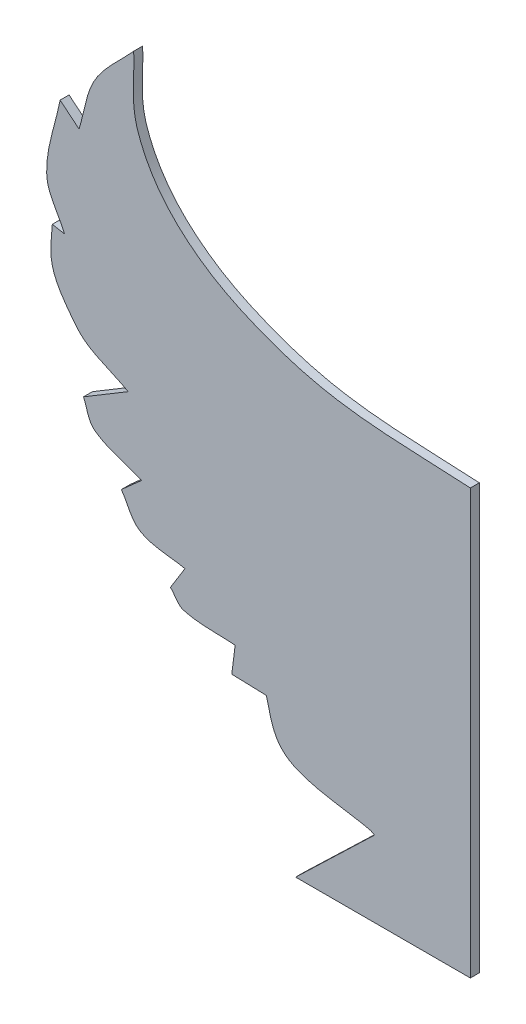
ISO-10303-21;
HEADER;
FILE_DESCRIPTION(('STEP AP214'),'2;1');
FILE_NAME('part.step','',(''),(''),'','','');
FILE_SCHEMA(('AUTOMOTIVE_DESIGN { 1 0 10303 214 1 1 1 1 }'));
ENDSEC;
DATA;
#1=APPLICATION_CONTEXT('core data for automotive mechanical design processes');
#2=APPLICATION_PROTOCOL_DEFINITION('international standard','automotive_design',2000,#1);
#3=PRODUCT_CONTEXT('',#1,'mechanical');
#4=PRODUCT('Part','Part','',(#3));
#5=PRODUCT_RELATED_PRODUCT_CATEGORY('part','',(#4));
#6=PRODUCT_DEFINITION_FORMATION('','',#4);
#7=PRODUCT_DEFINITION_CONTEXT('part definition',#1,'design');
#8=PRODUCT_DEFINITION('design','',#6,#7);
#9=PRODUCT_DEFINITION_SHAPE('','',#8);
#10=(LENGTH_UNIT() NAMED_UNIT(*) SI_UNIT(.MILLI.,.METRE.));
#11=(NAMED_UNIT(*) PLANE_ANGLE_UNIT() SI_UNIT($,.RADIAN.));
#12=(NAMED_UNIT(*) SI_UNIT($,.STERADIAN.) SOLID_ANGLE_UNIT());
#13=UNCERTAINTY_MEASURE_WITH_UNIT(LENGTH_MEASURE(1.E-05),#10,'distance_accuracy_value','');
#14=(GEOMETRIC_REPRESENTATION_CONTEXT(3) GLOBAL_UNCERTAINTY_ASSIGNED_CONTEXT((#13)) GLOBAL_UNIT_ASSIGNED_CONTEXT((#10,
#11,#12)) REPRESENTATION_CONTEXT('',''));
#15=CARTESIAN_POINT('',(0.,0.,0.));
#16=DIRECTION('',(0.,0.,1.));
#17=DIRECTION('',(1.,0.,0.));
#18=AXIS2_PLACEMENT_3D('',#15,#16,#17);
#19=CARTESIAN_POINT('',(-157.999999999995,101.119999999998,6.35));
#20=CARTESIAN_POINT('',(-154.480631293229,87.7463989142879,6.35));
#21=CARTESIAN_POINT('',(-153.288857754356,74.165061959317,6.35));
#22=CARTESIAN_POINT('',(-137.459999999995,67.1499999999983,6.35));
#23=CARTESIAN_POINT('',(-120.930466918882,59.8244114754145,6.35));
#24=CARTESIAN_POINT('',(-102.113096915258,59.5100372895688,6.35));
#25=CARTESIAN_POINT('',(-84.5299999999944,55.299999999999,6.35));
#26=CARTESIAN_POINT('',(-83.384709710233,55.0257755644223,6.35));
#27=CARTESIAN_POINT('',(-82.4233333333277,54.2466666666657,6.35));
#28=CARTESIAN_POINT('',(-81.3699999999944,53.719999999999,6.35));
#29=B_SPLINE_CURVE_WITH_KNOTS('',3,(#19,#20,#21,#22,#23,#24,#25,#26,#27,#28),.UNSPECIFIED.,.F.,
.F.,(4,3,3,4),(0.,1.,2.,3.),.UNSPECIFIED.);
#30=DIRECTION('',(0.,0.,-1.));
#31=VECTOR('',#30,1.);
#32=SURFACE_OF_LINEAR_EXTRUSION('',#29,#31);
#33=CARTESIAN_POINT('',(-157.999999999995,101.119999999998,0.));
#34=CARTESIAN_POINT('',(-154.480631293229,87.7463989142879,0.));
#35=CARTESIAN_POINT('',(-153.288857754356,74.165061959317,0.));
#36=CARTESIAN_POINT('',(-137.459999999995,67.1499999999983,0.));
#37=CARTESIAN_POINT('',(-120.930466918882,59.8244114754145,0.));
#38=CARTESIAN_POINT('',(-102.113096915258,59.5100372895688,0.));
#39=CARTESIAN_POINT('',(-84.5299999999944,55.299999999999,0.));
#40=CARTESIAN_POINT('',(-83.384709710233,55.0257755644223,0.));
#41=CARTESIAN_POINT('',(-82.4233333333277,54.2466666666657,0.));
#42=CARTESIAN_POINT('',(-81.3699999999944,53.719999999999,0.));
#43=B_SPLINE_CURVE_WITH_KNOTS('',3,(#33,#34,#35,#36,#37,#38,#39,#40,#41,#42),.UNSPECIFIED.,.F.,
.F.,(4,3,3,4),(0.,1.,2.,3.),.UNSPECIFIED.);
#44=CARTESIAN_POINT('',(-157.999999999995,101.119999999998,0.));
#45=VERTEX_POINT('',#44);
#46=CARTESIAN_POINT('',(-81.3699999999944,53.719999999999,0.));
#47=VERTEX_POINT('',#46);
#48=EDGE_CURVE('E193',#45,#47,#43,.T.);
#49=ORIENTED_EDGE('',*,*,#48,.T.);
#50=DIRECTION('',(0.,0.,-1.));
#51=VECTOR('',#50,1.);
#52=CARTESIAN_POINT('',(-81.3699999999944,53.719999999999,6.35));
#53=LINE('',#52,#51);
#54=CARTESIAN_POINT('',(-81.3699999999944,53.719999999999,6.35));
#55=VERTEX_POINT('',#54);
#56=EDGE_CURVE('E12',#55,#47,#53,.T.);
#57=ORIENTED_EDGE('',*,*,#56,.F.);
#58=CARTESIAN_POINT('',(-157.999999999995,101.119999999998,6.35));
#59=VERTEX_POINT('',#58);
#60=EDGE_CURVE('E267',#59,#55,#29,.T.);
#61=ORIENTED_EDGE('',*,*,#60,.F.);
#62=DIRECTION('',(0.,0.,-1.));
#63=VECTOR('',#62,1.);
#64=CARTESIAN_POINT('',(-157.999999999995,101.119999999998,6.35));
#65=LINE('',#64,#63);
#66=EDGE_CURVE('E186',#59,#45,#65,.T.);
#67=ORIENTED_EDGE('',*,*,#66,.T.);
#68=EDGE_LOOP('',(#49,#57,#61,#67));
#69=FACE_BOUND('',#68,.T.);
#70=ADVANCED_FACE('F33',(#69),#32,.F.);
#71=CARTESIAN_POINT('',(-81.3699999999944,53.719999999999,6.35));
#72=DIRECTION('',(0.693004296840328,-0.720933453628588,0.));
#73=DIRECTION('',(0.720933453628588,0.693004296840328,0.));
#74=AXIS2_PLACEMENT_3D('',#71,#72,#73);
#75=PLANE('',#74);
#76=DIRECTION('',(-0.720933453628588,-0.693004296840328,0.));
#77=VECTOR('',#76,1.);
#78=CARTESIAN_POINT('',(-81.3699999999944,53.719999999999,0.));
#79=LINE('',#78,#77);
#80=CARTESIAN_POINT('',(-137.255000000002,0.,0.));
#81=VERTEX_POINT('',#80);
#82=EDGE_CURVE('E198',#47,#81,#79,.T.);
#83=ORIENTED_EDGE('',*,*,#82,.T.);
#84=DIRECTION('',(0.,0.,-1.));
#85=VECTOR('',#84,1.);
#86=CARTESIAN_POINT('',(-137.255000000002,0.,6.35));
#87=LINE('',#86,#85);
#88=CARTESIAN_POINT('',(-137.255000000002,0.,6.35));
#89=VERTEX_POINT('',#88);
#90=EDGE_CURVE('E42',#89,#81,#87,.T.);
#91=ORIENTED_EDGE('',*,*,#90,.F.);
#92=DIRECTION('',(-0.720933453628588,-0.693004296840328,0.));
#93=VECTOR('',#92,1.);
#94=CARTESIAN_POINT('',(-81.3699999999944,53.719999999999,6.35));
#95=LINE('',#94,#93);
#96=EDGE_CURVE('E123',#55,#89,#95,.T.);
#97=ORIENTED_EDGE('',*,*,#96,.F.);
#98=ORIENTED_EDGE('',*,*,#56,.T.);
#99=EDGE_LOOP('',(#83,#91,#97,#98));
#100=FACE_BOUND('',#99,.T.);
#101=ADVANCED_FACE('F355',(#100),#75,.F.);
#102=CARTESIAN_POINT('',(-137.255000000002,0.,6.35));
#103=DIRECTION('',(0.,1.,0.));
#104=DIRECTION('',(0.,0.,1.));
#105=AXIS2_PLACEMENT_3D('',#102,#103,#104);
#106=PLANE('',#105);
#107=DIRECTION('',(1.,0.,0.));
#108=VECTOR('',#107,1.);
#109=CARTESIAN_POINT('',(-137.255000000002,0.,0.));
#110=LINE('',#109,#108);
#111=CARTESIAN_POINT('',(-13.4300000000021,0.,0.));
#112=VERTEX_POINT('',#111);
#113=EDGE_CURVE('E203',#81,#112,#110,.T.);
#114=ORIENTED_EDGE('',*,*,#113,.T.);
#115=DIRECTION('',(0.,0.,-1.));
#116=VECTOR('',#115,1.);
#117=CARTESIAN_POINT('',(-13.4300000000021,0.,6.35));
#118=LINE('',#117,#116);
#119=CARTESIAN_POINT('',(-13.4300000000021,0.,6.35));
#120=VERTEX_POINT('',#119);
#121=EDGE_CURVE('E304',#120,#112,#118,.T.);
#122=ORIENTED_EDGE('',*,*,#121,.F.);
#123=DIRECTION('',(1.,0.,0.));
#124=VECTOR('',#123,1.);
#125=CARTESIAN_POINT('',(-137.255000000002,0.,6.35));
#126=LINE('',#125,#124);
#127=EDGE_CURVE('E312',#89,#120,#126,.T.);
#128=ORIENTED_EDGE('',*,*,#127,.F.);
#129=ORIENTED_EDGE('',*,*,#90,.T.);
#130=EDGE_LOOP('',(#114,#122,#128,#129));
#131=FACE_BOUND('',#130,.T.);
#132=ADVANCED_FACE('F310',(#131),#106,.F.);
#133=CARTESIAN_POINT('',(-13.4300000000428,300.741120306681,6.35));
#134=DIRECTION('',(-1.,-1.35349919300316E-13,0.));
#135=DIRECTION('',(1.35349919300316E-13,-1.,0.));
#136=AXIS2_PLACEMENT_3D('',#133,#134,#135);
#137=PLANE('',#136);
#138=DIRECTION('',(-1.35349919300316E-13,1.,0.));
#139=VECTOR('',#138,1.);
#140=CARTESIAN_POINT('',(-13.4300000000428,300.741120306681,0.));
#141=LINE('',#140,#139);
#142=CARTESIAN_POINT('',(-13.4300000000428,300.741120306681,0.));
#143=VERTEX_POINT('',#142);
#144=EDGE_CURVE('E205',#112,#143,#141,.T.);
#145=ORIENTED_EDGE('',*,*,#144,.T.);
#146=DIRECTION('',(0.,0.,-1.));
#147=VECTOR('',#146,1.);
#148=CARTESIAN_POINT('',(-13.4300000000428,300.741120306681,6.35));
#149=LINE('',#148,#147);
#150=CARTESIAN_POINT('',(-13.4300000000428,300.741120306681,6.35));
#151=VERTEX_POINT('',#150);
#152=EDGE_CURVE('E301',#151,#143,#149,.T.);
#153=ORIENTED_EDGE('',*,*,#152,.F.);
#154=DIRECTION('',(-1.35349919300316E-13,1.,0.));
#155=VECTOR('',#154,1.);
#156=CARTESIAN_POINT('',(-13.4300000000428,300.741120306681,6.35));
#157=LINE('',#156,#155);
#158=EDGE_CURVE('E330',#120,#151,#157,.T.);
#159=ORIENTED_EDGE('',*,*,#158,.F.);
#160=ORIENTED_EDGE('',*,*,#121,.T.);
#161=EDGE_LOOP('',(#145,#153,#159,#160));
#162=FACE_BOUND('',#161,.T.);
#163=ADVANCED_FACE('F321',(#162),#137,.F.);
#164=CARTESIAN_POINT('',(-5.52999999999783,300.2,6.35));
#165=CARTESIAN_POINT('',(-40.5533333333312,302.833333333333,6.35));
#166=CARTESIAN_POINT('',(-75.9902994843211,302.121960820019,6.35));
#167=CARTESIAN_POINT('',(-110.599999999998,308.099999999999,6.35));
#168=CARTESIAN_POINT('',(-134.316102267515,312.196417664388,6.35));
#169=CARTESIAN_POINT('',(-157.597830165174,319.878484699289,6.35));
#170=CARTESIAN_POINT('',(-179.329999999998,330.219999999998,6.35));
#171=CARTESIAN_POINT('',(-196.219330524409,338.256991766786,6.35));
#172=CARTESIAN_POINT('',(-212.218015533089,349.096802748058,6.35));
#173=CARTESIAN_POINT('',(-225.149999999999,362.609999999997,6.35));
#174=CARTESIAN_POINT('',(-236.172283533926,374.127667063539,6.35));
#175=CARTESIAN_POINT('',(-244.932227199602,388.458970351653,6.35));
#176=CARTESIAN_POINT('',(-249.639999999999,403.689999999997,6.35));
#177=CARTESIAN_POINT('',(-254.156340492668,418.301689829219,6.35));
#178=CARTESIAN_POINT('',(-251.22,434.236666666663,6.35));
#179=CARTESIAN_POINT('',(-252.01,449.509999999997,6.35));
#180=B_SPLINE_CURVE_WITH_KNOTS('',3,(#164,#165,#166,#167,#168,#169,#170,#171,#172,#173,#174,
#175,#176,#177,#178,#179),.UNSPECIFIED.,.F.,.F.,(4,3,3,3,3,4),(0.,1.,2.,3.,4.,5.),.UNSPECIFIED.);
#181=DIRECTION('',(0.,0.,-1.));
#182=VECTOR('',#181,1.);
#183=SURFACE_OF_LINEAR_EXTRUSION('',#180,#182);
#184=CARTESIAN_POINT('',(-5.52999999999783,300.2,0.));
#185=CARTESIAN_POINT('',(-40.5533333333312,302.833333333333,0.));
#186=CARTESIAN_POINT('',(-75.9902994843211,302.121960820019,0.));
#187=CARTESIAN_POINT('',(-110.599999999998,308.099999999999,0.));
#188=CARTESIAN_POINT('',(-134.316102267515,312.196417664388,0.));
#189=CARTESIAN_POINT('',(-157.597830165174,319.878484699289,0.));
#190=CARTESIAN_POINT('',(-179.329999999998,330.219999999998,0.));
#191=CARTESIAN_POINT('',(-196.219330524409,338.256991766786,0.));
#192=CARTESIAN_POINT('',(-212.218015533089,349.096802748058,0.));
#193=CARTESIAN_POINT('',(-225.149999999999,362.609999999997,0.));
#194=CARTESIAN_POINT('',(-236.172283533926,374.127667063539,0.));
#195=CARTESIAN_POINT('',(-244.932227199602,388.458970351653,0.));
#196=CARTESIAN_POINT('',(-249.639999999999,403.689999999997,0.));
#197=CARTESIAN_POINT('',(-254.156340492668,418.301689829219,0.));
#198=CARTESIAN_POINT('',(-251.22,434.236666666663,0.));
#199=CARTESIAN_POINT('',(-252.01,449.509999999997,0.));
#200=B_SPLINE_CURVE_WITH_KNOTS('',3,(#184,#185,#186,#187,#188,#189,#190,#191,#192,#193,#194,
#195,#196,#197,#198,#199),.UNSPECIFIED.,.F.,.F.,(4,3,3,3,3,4),(0.,1.,2.,3.,4.,5.),.UNSPECIFIED.);
#201=CARTESIAN_POINT('',(-252.01,449.509999999997,0.));
#202=VERTEX_POINT('',#201);
#203=EDGE_CURVE('E207',#143,#202,#200,.T.);
#204=ORIENTED_EDGE('',*,*,#203,.T.);
#205=DIRECTION('',(0.,0.,-1.));
#206=VECTOR('',#205,1.);
#207=CARTESIAN_POINT('',(-252.01,449.509999999997,6.35));
#208=LINE('',#207,#206);
#209=CARTESIAN_POINT('',(-252.01,449.509999999997,6.35));
#210=VERTEX_POINT('',#209);
#211=EDGE_CURVE('E298',#210,#202,#208,.T.);
#212=ORIENTED_EDGE('',*,*,#211,.F.);
#213=EDGE_CURVE('E327',#151,#210,#180,.T.);
#214=ORIENTED_EDGE('',*,*,#213,.F.);
#215=ORIENTED_EDGE('',*,*,#152,.T.);
#216=EDGE_LOOP('',(#204,#212,#214,#215));
#217=FACE_BOUND('',#216,.T.);
#218=ADVANCED_FACE('F325',(#217),#183,.F.);
#219=CARTESIAN_POINT('',(-252.01,449.509999999997,6.35));
#220=CARTESIAN_POINT('',(-261.226666666667,438.976666666663,6.35));
#221=CARTESIAN_POINT('',(-272.669822336166,430.035818396443,6.35));
#222=CARTESIAN_POINT('',(-279.66,417.909999999996,6.35));
#223=CARTESIAN_POINT('',(-285.858024194383,407.158325377085,6.35));
#224=CARTESIAN_POINT('',(-287.033333333333,394.209999999996,6.35));
#225=CARTESIAN_POINT('',(-290.719999999999,382.359999999996,6.35));
#226=B_SPLINE_CURVE_WITH_KNOTS('',3,(#219,#220,#221,#222,#223,#224,#225),.UNSPECIFIED.,.F.,.F.,
(4,3,4),(0.,1.,2.),.UNSPECIFIED.);
#227=DIRECTION('',(0.,0.,-1.));
#228=VECTOR('',#227,1.);
#229=SURFACE_OF_LINEAR_EXTRUSION('',#226,#228);
#230=CARTESIAN_POINT('',(-252.01,449.509999999997,0.));
#231=CARTESIAN_POINT('',(-261.226666666667,438.976666666663,0.));
#232=CARTESIAN_POINT('',(-272.669822336166,430.035818396443,0.));
#233=CARTESIAN_POINT('',(-279.66,417.909999999996,0.));
#234=CARTESIAN_POINT('',(-285.858024194383,407.158325377085,0.));
#235=CARTESIAN_POINT('',(-287.033333333333,394.209999999996,0.));
#236=CARTESIAN_POINT('',(-290.719999999999,382.359999999996,0.));
#237=B_SPLINE_CURVE_WITH_KNOTS('',3,(#230,#231,#232,#233,#234,#235,#236),.UNSPECIFIED.,.F.,.F.,
(4,3,4),(0.,1.,2.),.UNSPECIFIED.);
#238=CARTESIAN_POINT('',(-290.719999999999,382.359999999996,0.));
#239=VERTEX_POINT('',#238);
#240=EDGE_CURVE('E211',#202,#239,#237,.T.);
#241=ORIENTED_EDGE('',*,*,#240,.T.);
#242=DIRECTION('',(0.,0.,-1.));
#243=VECTOR('',#242,1.);
#244=CARTESIAN_POINT('',(-290.719999999999,382.359999999996,6.35));
#245=LINE('',#244,#243);
#246=CARTESIAN_POINT('',(-290.719999999999,382.359999999996,6.35));
#247=VERTEX_POINT('',#246);
#248=EDGE_CURVE('E295',#247,#239,#245,.T.);
#249=ORIENTED_EDGE('',*,*,#248,.F.);
#250=EDGE_CURVE('E329',#210,#247,#226,.T.);
#251=ORIENTED_EDGE('',*,*,#250,.F.);
#252=ORIENTED_EDGE('',*,*,#211,.T.);
#253=EDGE_LOOP('',(#241,#249,#251,#252));
#254=FACE_BOUND('',#253,.T.);
#255=ADVANCED_FACE('F350',(#254),#229,.F.);
#256=CARTESIAN_POINT('',(-304.149999999999,393.419999999996,6.35));
#257=DIRECTION('',(-0.635707252861087,-0.771930235617061,0.));
#258=DIRECTION('',(0.771930235617061,-0.635707252861087,0.));
#259=AXIS2_PLACEMENT_3D('',#256,#257,#258);
#260=PLANE('',#259);
#261=DIRECTION('',(-0.771930235617061,0.635707252861086,0.));
#262=VECTOR('',#261,1.);
#263=CARTESIAN_POINT('',(-304.149999999999,393.419999999996,0.));
#264=LINE('',#263,#262);
#265=CARTESIAN_POINT('',(-304.149999999999,393.419999999996,0.));
#266=VERTEX_POINT('',#265);
#267=EDGE_CURVE('E218',#239,#266,#264,.T.);
#268=ORIENTED_EDGE('',*,*,#267,.T.);
#269=DIRECTION('',(0.,0.,-1.));
#270=VECTOR('',#269,1.);
#271=CARTESIAN_POINT('',(-304.149999999999,393.419999999996,6.35));
#272=LINE('',#271,#270);
#273=CARTESIAN_POINT('',(-304.149999999999,393.419999999996,6.35));
#274=VERTEX_POINT('',#273);
#275=EDGE_CURVE('E292',#274,#266,#272,.T.);
#276=ORIENTED_EDGE('',*,*,#275,.F.);
#277=DIRECTION('',(-0.771930235617061,0.635707252861086,0.));
#278=VECTOR('',#277,1.);
#279=CARTESIAN_POINT('',(-304.149999999999,393.419999999996,6.35));
#280=LINE('',#279,#278);
#281=EDGE_CURVE('E332',#247,#274,#280,.T.);
#282=ORIENTED_EDGE('',*,*,#281,.F.);
#283=ORIENTED_EDGE('',*,*,#248,.T.);
#284=EDGE_LOOP('',(#268,#276,#282,#283));
#285=FACE_BOUND('',#284,.T.);
#286=ADVANCED_FACE('F412',(#285),#260,.F.);
#287=CARTESIAN_POINT('',(-304.149999999999,393.419999999996,6.35));
#288=CARTESIAN_POINT('',(-307.309999999999,376.566666666663,6.35));
#289=CARTESIAN_POINT('',(-314.301915866732,359.993854601704,6.35));
#290=CARTESIAN_POINT('',(-313.629999999998,342.859999999996,6.35));
#291=CARTESIAN_POINT('',(-313.204542259722,332.010827622953,6.35));
#292=CARTESIAN_POINT('',(-305.203333333332,322.846666666663,6.35));
#293=CARTESIAN_POINT('',(-300.989999999998,312.839999999996,6.35));
#294=B_SPLINE_CURVE_WITH_KNOTS('',3,(#287,#288,#289,#290,#291,#292,#293),.UNSPECIFIED.,.F.,.F.,
(4,3,4),(0.,1.,2.),.UNSPECIFIED.);
#295=DIRECTION('',(0.,0.,-1.));
#296=VECTOR('',#295,1.);
#297=SURFACE_OF_LINEAR_EXTRUSION('',#294,#296);
#298=CARTESIAN_POINT('',(-304.149999999999,393.419999999996,0.));
#299=CARTESIAN_POINT('',(-307.309999999999,376.566666666663,0.));
#300=CARTESIAN_POINT('',(-314.301915866732,359.993854601704,0.));
#301=CARTESIAN_POINT('',(-313.629999999998,342.859999999996,0.));
#302=CARTESIAN_POINT('',(-313.204542259722,332.010827622953,0.));
#303=CARTESIAN_POINT('',(-305.203333333332,322.846666666663,0.));
#304=CARTESIAN_POINT('',(-300.989999999998,312.839999999996,0.));
#305=B_SPLINE_CURVE_WITH_KNOTS('',3,(#298,#299,#300,#301,#302,#303,#304),.UNSPECIFIED.,.F.,.F.,
(4,3,4),(0.,1.,2.),.UNSPECIFIED.);
#306=CARTESIAN_POINT('',(-300.989999999998,312.839999999996,0.));
#307=VERTEX_POINT('',#306);
#308=EDGE_CURVE('E223',#266,#307,#305,.T.);
#309=ORIENTED_EDGE('',*,*,#308,.T.);
#310=DIRECTION('',(0.,0.,-1.));
#311=VECTOR('',#310,1.);
#312=CARTESIAN_POINT('',(-300.989999999998,312.839999999996,6.35));
#313=LINE('',#312,#311);
#314=CARTESIAN_POINT('',(-300.989999999998,312.839999999996,6.35));
#315=VERTEX_POINT('',#314);
#316=EDGE_CURVE('E289',#315,#307,#313,.T.);
#317=ORIENTED_EDGE('',*,*,#316,.F.);
#318=EDGE_CURVE('E408',#274,#315,#294,.T.);
#319=ORIENTED_EDGE('',*,*,#318,.F.);
#320=ORIENTED_EDGE('',*,*,#275,.T.);
#321=EDGE_LOOP('',(#309,#317,#319,#320));
#322=FACE_BOUND('',#321,.T.);
#323=ADVANCED_FACE('F407',(#322),#297,.F.);
#324=CARTESIAN_POINT('',(-309.679999999998,314.419999999996,6.35));
#325=DIRECTION('',(-0.178885438199979,-0.983869910099908,0.));
#326=DIRECTION('',(0.983869910099908,-0.178885438199979,0.));
#327=AXIS2_PLACEMENT_3D('',#324,#325,#326);
#328=PLANE('',#327);
#329=DIRECTION('',(-0.983869910099908,0.178885438199979,0.));
#330=VECTOR('',#329,1.);
#331=CARTESIAN_POINT('',(-309.679999999998,314.419999999996,0.));
#332=LINE('',#331,#330);
#333=CARTESIAN_POINT('',(-309.679999999998,314.419999999996,0.));
#334=VERTEX_POINT('',#333);
#335=EDGE_CURVE('E227',#307,#334,#332,.T.);
#336=ORIENTED_EDGE('',*,*,#335,.T.);
#337=DIRECTION('',(0.,0.,-1.));
#338=VECTOR('',#337,1.);
#339=CARTESIAN_POINT('',(-309.679999999998,314.419999999996,6.35));
#340=LINE('',#339,#338);
#341=CARTESIAN_POINT('',(-309.679999999998,314.419999999996,6.35));
#342=VERTEX_POINT('',#341);
#343=EDGE_CURVE('E286',#342,#334,#340,.T.);
#344=ORIENTED_EDGE('',*,*,#343,.F.);
#345=DIRECTION('',(-0.983869910099908,0.178885438199979,0.));
#346=VECTOR('',#345,1.);
#347=CARTESIAN_POINT('',(-309.679999999998,314.419999999996,6.35));
#348=LINE('',#347,#346);
#349=EDGE_CURVE('E404',#315,#342,#348,.T.);
#350=ORIENTED_EDGE('',*,*,#349,.F.);
#351=ORIENTED_EDGE('',*,*,#316,.T.);
#352=EDGE_LOOP('',(#336,#344,#350,#351));
#353=FACE_BOUND('',#352,.T.);
#354=ADVANCED_FACE('F401',(#353),#328,.F.);
#355=CARTESIAN_POINT('',(-309.679999999998,314.419999999996,6.35));
#356=CARTESIAN_POINT('',(-311.452418298337,293.150980419928,6.35));
#357=CARTESIAN_POINT('',(-313.503064948443,285.722426893755,6.35));
#358=CARTESIAN_POINT('',(-292.299999999997,259.909999999996,6.35));
#359=CARTESIAN_POINT('',(-283.384566911672,249.056429283774,6.35));
#360=CARTESIAN_POINT('',(-268.07333333333,245.689999999996,6.35));
#361=CARTESIAN_POINT('',(-255.959999999997,238.579999999997,6.35));
#362=B_SPLINE_CURVE_WITH_KNOTS('',3,(#355,#356,#357,#358,#359,#360,#361),.UNSPECIFIED.,.F.,.F.,
(4,3,4),(0.,1.,2.),.UNSPECIFIED.);
#363=DIRECTION('',(0.,0.,-1.));
#364=VECTOR('',#363,1.);
#365=SURFACE_OF_LINEAR_EXTRUSION('',#362,#364);
#366=CARTESIAN_POINT('',(-309.679999999998,314.419999999996,0.));
#367=CARTESIAN_POINT('',(-311.452418298337,293.150980419928,0.));
#368=CARTESIAN_POINT('',(-313.503064948443,285.722426893755,0.));
#369=CARTESIAN_POINT('',(-292.299999999997,259.909999999996,0.));
#370=CARTESIAN_POINT('',(-283.384566911672,249.056429283774,0.));
#371=CARTESIAN_POINT('',(-268.07333333333,245.689999999996,0.));
#372=CARTESIAN_POINT('',(-255.959999999997,238.579999999997,0.));
#373=B_SPLINE_CURVE_WITH_KNOTS('',3,(#366,#367,#368,#369,#370,#371,#372),.UNSPECIFIED.,.F.,.F.,
(4,3,4),(0.,1.,2.),.UNSPECIFIED.);
#374=CARTESIAN_POINT('',(-255.959999999997,238.579999999997,0.));
#375=VERTEX_POINT('',#374);
#376=EDGE_CURVE('E232',#334,#375,#373,.T.);
#377=ORIENTED_EDGE('',*,*,#376,.T.);
#378=DIRECTION('',(0.,0.,-1.));
#379=VECTOR('',#378,1.);
#380=CARTESIAN_POINT('',(-255.959999999997,238.579999999997,6.35));
#381=LINE('',#380,#379);
#382=CARTESIAN_POINT('',(-255.959999999997,238.579999999997,6.35));
#383=VERTEX_POINT('',#382);
#384=EDGE_CURVE('E283',#383,#375,#381,.T.);
#385=ORIENTED_EDGE('',*,*,#384,.F.);
#386=EDGE_CURVE('E395',#342,#383,#362,.T.);
#387=ORIENTED_EDGE('',*,*,#386,.F.);
#388=ORIENTED_EDGE('',*,*,#343,.T.);
#389=EDGE_LOOP('',(#377,#385,#387,#388));
#390=FACE_BOUND('',#389,.T.);
#391=ADVANCED_FACE('F394',(#390),#365,.F.);
#392=CARTESIAN_POINT('',(-287.559999999997,219.619999999996,6.35));
#393=DIRECTION('',(0.514495755427536,-0.857492925712538,0.));
#394=DIRECTION('',(0.857492925712538,0.514495755427536,0.));
#395=AXIS2_PLACEMENT_3D('',#392,#393,#394);
#396=PLANE('',#395);
#397=DIRECTION('',(-0.857492925712538,-0.514495755427536,0.));
#398=VECTOR('',#397,1.);
#399=CARTESIAN_POINT('',(-287.559999999997,219.619999999996,0.));
#400=LINE('',#399,#398);
#401=CARTESIAN_POINT('',(-287.559999999997,219.619999999996,0.));
#402=VERTEX_POINT('',#401);
#403=EDGE_CURVE('E236',#375,#402,#400,.T.);
#404=ORIENTED_EDGE('',*,*,#403,.T.);
#405=DIRECTION('',(0.,0.,-1.));
#406=VECTOR('',#405,1.);
#407=CARTESIAN_POINT('',(-287.559999999997,219.619999999996,6.35));
#408=LINE('',#407,#406);
#409=CARTESIAN_POINT('',(-287.559999999997,219.619999999996,6.35));
#410=VERTEX_POINT('',#409);
#411=EDGE_CURVE('E280',#410,#402,#408,.T.);
#412=ORIENTED_EDGE('',*,*,#411,.F.);
#413=DIRECTION('',(-0.857492925712538,-0.514495755427536,0.));
#414=VECTOR('',#413,1.);
#415=CARTESIAN_POINT('',(-287.559999999997,219.619999999996,6.35));
#416=LINE('',#415,#414);
#417=EDGE_CURVE('E390',#383,#410,#416,.T.);
#418=ORIENTED_EDGE('',*,*,#417,.F.);
#419=ORIENTED_EDGE('',*,*,#384,.T.);
#420=EDGE_LOOP('',(#404,#412,#418,#419));
#421=FACE_BOUND('',#420,.T.);
#422=ADVANCED_FACE('F389',(#421),#396,.F.);
#423=CARTESIAN_POINT('',(-287.559999999997,219.619999999996,6.35));
#424=CARTESIAN_POINT('',(-284.926666666663,214.089999999996,6.35));
#425=CARTESIAN_POINT('',(-284.559981677967,206.704986258474,6.35));
#426=CARTESIAN_POINT('',(-279.659999999997,203.029999999996,6.35));
#427=CARTESIAN_POINT('',(-270.033662794185,195.810247095637,6.35));
#428=CARTESIAN_POINT('',(-257.539999999996,193.549999999997,6.35));
#429=CARTESIAN_POINT('',(-246.479999999996,188.809999999997,6.35));
#430=B_SPLINE_CURVE_WITH_KNOTS('',3,(#423,#424,#425,#426,#427,#428,#429),.UNSPECIFIED.,.F.,.F.,
(4,3,4),(0.,1.,2.),.UNSPECIFIED.);
#431=DIRECTION('',(0.,0.,-1.));
#432=VECTOR('',#431,1.);
#433=SURFACE_OF_LINEAR_EXTRUSION('',#430,#432);
#434=CARTESIAN_POINT('',(-287.559999999997,219.619999999996,0.));
#435=CARTESIAN_POINT('',(-284.926666666663,214.089999999996,0.));
#436=CARTESIAN_POINT('',(-284.559981677967,206.704986258474,0.));
#437=CARTESIAN_POINT('',(-279.659999999997,203.029999999996,0.));
#438=CARTESIAN_POINT('',(-270.033662794185,195.810247095637,0.));
#439=CARTESIAN_POINT('',(-257.539999999996,193.549999999997,0.));
#440=CARTESIAN_POINT('',(-246.479999999996,188.809999999997,0.));
#441=B_SPLINE_CURVE_WITH_KNOTS('',3,(#434,#435,#436,#437,#438,#439,#440),.UNSPECIFIED.,.F.,.F.,
(4,3,4),(0.,1.,2.),.UNSPECIFIED.);
#442=CARTESIAN_POINT('',(-246.479999999996,188.809999999997,0.));
#443=VERTEX_POINT('',#442);
#444=EDGE_CURVE('E241',#402,#443,#441,.T.);
#445=ORIENTED_EDGE('',*,*,#444,.T.);
#446=DIRECTION('',(0.,0.,-1.));
#447=VECTOR('',#446,1.);
#448=CARTESIAN_POINT('',(-246.479999999996,188.809999999997,6.35));
#449=LINE('',#448,#447);
#450=CARTESIAN_POINT('',(-246.479999999996,188.809999999997,6.35));
#451=VERTEX_POINT('',#450);
#452=EDGE_CURVE('E277',#451,#443,#449,.T.);
#453=ORIENTED_EDGE('',*,*,#452,.F.);
#454=EDGE_CURVE('E386',#410,#451,#430,.T.);
#455=ORIENTED_EDGE('',*,*,#454,.F.);
#456=ORIENTED_EDGE('',*,*,#411,.T.);
#457=EDGE_LOOP('',(#445,#453,#455,#456));
#458=FACE_BOUND('',#457,.T.);
#459=ADVANCED_FACE('F383',(#458),#433,.F.);
#460=CARTESIAN_POINT('',(-260.699999999996,176.169999999996,6.35));
#461=DIRECTION('',(0.664363838829933,-0.747409318683648,0.));
#462=DIRECTION('',(0.747409318683648,0.664363838829933,0.));
#463=AXIS2_PLACEMENT_3D('',#460,#461,#462);
#464=PLANE('',#463);
#465=DIRECTION('',(-0.747409318683648,-0.664363838829933,0.));
#466=VECTOR('',#465,1.);
#467=CARTESIAN_POINT('',(-260.699999999996,176.169999999996,0.));
#468=LINE('',#467,#466);
#469=CARTESIAN_POINT('',(-260.699999999996,176.169999999996,0.));
#470=VERTEX_POINT('',#469);
#471=EDGE_CURVE('E245',#443,#470,#468,.T.);
#472=ORIENTED_EDGE('',*,*,#471,.T.);
#473=DIRECTION('',(0.,0.,-1.));
#474=VECTOR('',#473,1.);
#475=CARTESIAN_POINT('',(-260.699999999996,176.169999999996,6.35));
#476=LINE('',#475,#474);
#477=CARTESIAN_POINT('',(-260.699999999996,176.169999999996,6.35));
#478=VERTEX_POINT('',#477);
#479=EDGE_CURVE('E274',#478,#470,#476,.T.);
#480=ORIENTED_EDGE('',*,*,#479,.F.);
#481=DIRECTION('',(-0.747409318683648,-0.664363838829933,0.));
#482=VECTOR('',#481,1.);
#483=CARTESIAN_POINT('',(-260.699999999996,176.169999999996,6.35));
#484=LINE('',#483,#482);
#485=EDGE_CURVE('E377',#451,#478,#484,.T.);
#486=ORIENTED_EDGE('',*,*,#485,.F.);
#487=ORIENTED_EDGE('',*,*,#452,.T.);
#488=EDGE_LOOP('',(#472,#480,#486,#487));
#489=FACE_BOUND('',#488,.T.);
#490=ADVANCED_FACE('F376',(#489),#464,.F.);
#491=CARTESIAN_POINT('',(-260.699999999996,176.169999999996,6.35));
#492=CARTESIAN_POINT('',(-256.223333333329,169.849999999997,6.35));
#493=CARTESIAN_POINT('',(-253.972610339402,161.090458617548,6.35));
#494=CARTESIAN_POINT('',(-247.269999999996,157.209999999997,6.35));
#495=CARTESIAN_POINT('',(-237.926280871085,151.800478399048,6.35));
#496=CARTESIAN_POINT('',(-226.203333333329,152.469999999997,6.35));
#497=CARTESIAN_POINT('',(-215.669999999996,150.099999999997,6.35));
#498=B_SPLINE_CURVE_WITH_KNOTS('',3,(#491,#492,#493,#494,#495,#496,#497),.UNSPECIFIED.,.F.,.F.,
(4,3,4),(0.,1.,2.),.UNSPECIFIED.);
#499=DIRECTION('',(0.,0.,-1.));
#500=VECTOR('',#499,1.);
#501=SURFACE_OF_LINEAR_EXTRUSION('',#498,#500);
#502=CARTESIAN_POINT('',(-260.699999999996,176.169999999996,0.));
#503=CARTESIAN_POINT('',(-256.223333333329,169.849999999997,0.));
#504=CARTESIAN_POINT('',(-253.972610339402,161.090458617548,0.));
#505=CARTESIAN_POINT('',(-247.269999999996,157.209999999997,0.));
#506=CARTESIAN_POINT('',(-237.926280871085,151.800478399048,0.));
#507=CARTESIAN_POINT('',(-226.203333333329,152.469999999997,0.));
#508=CARTESIAN_POINT('',(-215.669999999996,150.099999999997,0.));
#509=B_SPLINE_CURVE_WITH_KNOTS('',3,(#502,#503,#504,#505,#506,#507,#508),.UNSPECIFIED.,.F.,.F.,
(4,3,4),(0.,1.,2.),.UNSPECIFIED.);
#510=CARTESIAN_POINT('',(-215.669999999996,150.099999999997,0.));
#511=VERTEX_POINT('',#510);
#512=EDGE_CURVE('E250',#470,#511,#509,.T.);
#513=ORIENTED_EDGE('',*,*,#512,.T.);
#514=DIRECTION('',(0.,0.,-1.));
#515=VECTOR('',#514,1.);
#516=CARTESIAN_POINT('',(-215.669999999996,150.099999999997,6.35));
#517=LINE('',#516,#515);
#518=CARTESIAN_POINT('',(-215.669999999996,150.099999999997,6.35));
#519=VERTEX_POINT('',#518);
#520=EDGE_CURVE('E271',#519,#511,#517,.T.);
#521=ORIENTED_EDGE('',*,*,#520,.F.);
#522=EDGE_CURVE('E372',#478,#519,#498,.T.);
#523=ORIENTED_EDGE('',*,*,#522,.F.);
#524=ORIENTED_EDGE('',*,*,#479,.T.);
#525=EDGE_LOOP('',(#513,#521,#523,#524));
#526=FACE_BOUND('',#525,.T.);
#527=ADVANCED_FACE('F371',(#526),#501,.F.);
#528=CARTESIAN_POINT('',(-225.939999999996,133.509999999997,6.35));
#529=DIRECTION('',(0.850265146687871,-0.526354614616281,0.));
#530=DIRECTION('',(0.526354614616281,0.850265146687871,0.));
#531=AXIS2_PLACEMENT_3D('',#528,#529,#530);
#532=PLANE('',#531);
#533=DIRECTION('',(-0.526354614616281,-0.850265146687871,0.));
#534=VECTOR('',#533,1.);
#535=CARTESIAN_POINT('',(-225.939999999996,133.509999999997,0.));
#536=LINE('',#535,#534);
#537=CARTESIAN_POINT('',(-225.939999999996,133.509999999997,0.));
#538=VERTEX_POINT('',#537);
#539=EDGE_CURVE('E254',#511,#538,#536,.T.);
#540=ORIENTED_EDGE('',*,*,#539,.T.);
#541=DIRECTION('',(0.,0.,-1.));
#542=VECTOR('',#541,1.);
#543=CARTESIAN_POINT('',(-225.939999999996,133.509999999997,6.35));
#544=LINE('',#543,#542);
#545=CARTESIAN_POINT('',(-225.939999999996,133.509999999997,6.35));
#546=VERTEX_POINT('',#545);
#547=EDGE_CURVE('E181',#546,#538,#544,.T.);
#548=ORIENTED_EDGE('',*,*,#547,.F.);
#549=DIRECTION('',(-0.526354614616281,-0.850265146687871,0.));
#550=VECTOR('',#549,1.);
#551=CARTESIAN_POINT('',(-225.939999999996,133.509999999997,6.35));
#552=LINE('',#551,#550);
#553=EDGE_CURVE('E172',#519,#546,#552,.T.);
#554=ORIENTED_EDGE('',*,*,#553,.F.);
#555=ORIENTED_EDGE('',*,*,#520,.T.);
#556=EDGE_LOOP('',(#540,#548,#554,#555));
#557=FACE_BOUND('',#556,.T.);
#558=ADVANCED_FACE('F367',(#557),#532,.F.);
#559=CARTESIAN_POINT('',(-225.939999999996,133.509999999997,6.35));
#560=CARTESIAN_POINT('',(-222.779999999995,130.349999999997,6.35));
#561=CARTESIAN_POINT('',(-220.76800093363,125.218414050655,6.35));
#562=CARTESIAN_POINT('',(-216.459999999995,124.029999999997,6.35));
#563=CARTESIAN_POINT('',(-204.738771158725,120.796557561026,6.35));
#564=CARTESIAN_POINT('',(-192.233333333329,121.923333333331,6.35));
#565=CARTESIAN_POINT('',(-180.119999999995,120.869999999998,6.35));
#566=B_SPLINE_CURVE_WITH_KNOTS('',3,(#559,#560,#561,#562,#563,#564,#565),.UNSPECIFIED.,.F.,.F.,
(4,3,4),(0.,1.,2.),.UNSPECIFIED.);
#567=DIRECTION('',(0.,0.,-1.));
#568=VECTOR('',#567,1.);
#569=SURFACE_OF_LINEAR_EXTRUSION('',#566,#568);
#570=CARTESIAN_POINT('',(-225.939999999996,133.509999999997,0.));
#571=CARTESIAN_POINT('',(-222.779999999995,130.349999999997,0.));
#572=CARTESIAN_POINT('',(-220.76800093363,125.218414050655,0.));
#573=CARTESIAN_POINT('',(-216.459999999995,124.029999999997,0.));
#574=CARTESIAN_POINT('',(-204.738771158725,120.796557561026,0.));
#575=CARTESIAN_POINT('',(-192.233333333329,121.923333333331,0.));
#576=CARTESIAN_POINT('',(-180.119999999995,120.869999999998,0.));
#577=B_SPLINE_CURVE_WITH_KNOTS('',3,(#570,#571,#572,#573,#574,#575,#576),.UNSPECIFIED.,.F.,.F.,
(4,3,4),(0.,1.,2.),.UNSPECIFIED.);
#578=CARTESIAN_POINT('',(-180.119999999995,120.869999999998,0.));
#579=VERTEX_POINT('',#578);
#580=EDGE_CURVE('E180',#538,#579,#577,.T.);
#581=ORIENTED_EDGE('',*,*,#580,.T.);
#582=DIRECTION('',(0.,0.,-1.));
#583=VECTOR('',#582,1.);
#584=CARTESIAN_POINT('',(-180.119999999995,120.869999999998,6.35));
#585=LINE('',#584,#583);
#586=CARTESIAN_POINT('',(-180.119999999995,120.869999999998,6.35));
#587=VERTEX_POINT('',#586);
#588=EDGE_CURVE('E177',#587,#579,#585,.T.);
#589=ORIENTED_EDGE('',*,*,#588,.F.);
#590=EDGE_CURVE('E166',#546,#587,#566,.T.);
#591=ORIENTED_EDGE('',*,*,#590,.F.);
#592=ORIENTED_EDGE('',*,*,#547,.T.);
#593=EDGE_LOOP('',(#581,#589,#591,#592));
#594=FACE_BOUND('',#593,.T.);
#595=ADVANCED_FACE('F178',(#594),#569,.F.);
#596=CARTESIAN_POINT('',(-182.489999999995,101.909999999998,6.35));
#597=DIRECTION('',(0.99227787671367,-0.124034734589191,0.));
#598=DIRECTION('',(0.124034734589191,0.99227787671367,0.));
#599=AXIS2_PLACEMENT_3D('',#596,#597,#598);
#600=PLANE('',#599);
#601=DIRECTION('',(-0.124034734589191,-0.99227787671367,0.));
#602=VECTOR('',#601,1.);
#603=CARTESIAN_POINT('',(-182.489999999995,101.909999999998,0.));
#604=LINE('',#603,#602);
#605=CARTESIAN_POINT('',(-182.489999999995,101.909999999998,0.));
#606=VERTEX_POINT('',#605);
#607=EDGE_CURVE('E109',#579,#606,#604,.T.);
#608=ORIENTED_EDGE('',*,*,#607,.T.);
#609=DIRECTION('',(0.,0.,-1.));
#610=VECTOR('',#609,1.);
#611=CARTESIAN_POINT('',(-182.489999999995,101.909999999998,6.35));
#612=LINE('',#611,#610);
#613=CARTESIAN_POINT('',(-182.489999999995,101.909999999998,6.35));
#614=VERTEX_POINT('',#613);
#615=EDGE_CURVE('E182',#614,#606,#612,.T.);
#616=ORIENTED_EDGE('',*,*,#615,.F.);
#617=DIRECTION('',(-0.124034734589191,-0.99227787671367,0.));
#618=VECTOR('',#617,1.);
#619=CARTESIAN_POINT('',(-182.489999999995,101.909999999998,6.35));
#620=LINE('',#619,#618);
#621=EDGE_CURVE('E170',#587,#614,#620,.T.);
#622=ORIENTED_EDGE('',*,*,#621,.F.);
#623=ORIENTED_EDGE('',*,*,#588,.T.);
#624=EDGE_LOOP('',(#608,#616,#622,#623));
#625=FACE_BOUND('',#624,.T.);
#626=ADVANCED_FACE('F184',(#625),#600,.F.);
#627=CARTESIAN_POINT('',(-157.999999999995,101.119999999998,6.35));
#628=DIRECTION('',(0.0322412940109439,0.9994801143397,0.));
#629=DIRECTION('',(-0.9994801143397,0.0322412940109439,0.));
#630=AXIS2_PLACEMENT_3D('',#627,#628,#629);
#631=PLANE('',#630);
#632=DIRECTION('',(0.9994801143397,-0.0322412940109439,0.));
#633=VECTOR('',#632,1.);
#634=CARTESIAN_POINT('',(-157.999999999995,101.119999999998,0.));
#635=LINE('',#634,#633);
#636=EDGE_CURVE('E115',#606,#45,#635,.T.);
#637=ORIENTED_EDGE('',*,*,#636,.T.);
#638=ORIENTED_EDGE('',*,*,#66,.F.);
#639=DIRECTION('',(0.9994801143397,-0.0322412940109439,0.));
#640=VECTOR('',#639,1.);
#641=CARTESIAN_POINT('',(-157.999999999995,101.119999999998,6.35));
#642=LINE('',#641,#640);
#643=EDGE_CURVE('E50',#614,#59,#642,.T.);
#644=ORIENTED_EDGE('',*,*,#643,.F.);
#645=ORIENTED_EDGE('',*,*,#615,.T.);
#646=EDGE_LOOP('',(#637,#638,#644,#645));
#647=FACE_BOUND('',#646,.T.);
#648=ADVANCED_FACE('F535',(#647),#631,.F.);
#649=CARTESIAN_POINT('',(-111.390086437801,60.0566682868684,6.35));
#650=DIRECTION('',(0.,0.,1.));
#651=DIRECTION('',(1.,0.,0.));
#652=AXIS2_PLACEMENT_3D('',#649,#650,#651);
#653=PLANE('',#652);
#654=ORIENTED_EDGE('',*,*,#60,.T.);
#655=ORIENTED_EDGE('',*,*,#96,.T.);
#656=ORIENTED_EDGE('',*,*,#127,.T.);
#657=ORIENTED_EDGE('',*,*,#158,.T.);
#658=ORIENTED_EDGE('',*,*,#213,.T.);
#659=ORIENTED_EDGE('',*,*,#250,.T.);
#660=ORIENTED_EDGE('',*,*,#281,.T.);
#661=ORIENTED_EDGE('',*,*,#318,.T.);
#662=ORIENTED_EDGE('',*,*,#349,.T.);
#663=ORIENTED_EDGE('',*,*,#386,.T.);
#664=ORIENTED_EDGE('',*,*,#417,.T.);
#665=ORIENTED_EDGE('',*,*,#454,.T.);
#666=ORIENTED_EDGE('',*,*,#485,.T.);
#667=ORIENTED_EDGE('',*,*,#522,.T.);
#668=ORIENTED_EDGE('',*,*,#553,.T.);
#669=ORIENTED_EDGE('',*,*,#590,.T.);
#670=ORIENTED_EDGE('',*,*,#621,.T.);
#671=ORIENTED_EDGE('',*,*,#643,.T.);
#672=EDGE_LOOP('',(#654,#655,#656,#657,#658,#659,#660,#661,#662,#663,#664,#665,#666,#667,#668,
#669,#670,#671));
#673=FACE_BOUND('',#672,.T.);
#674=ADVANCED_FACE('F168',(#673),#653,.T.);
#675=CARTESIAN_POINT('',(-111.390086437801,60.0566682868684,0.));
#676=DIRECTION('',(0.,0.,1.));
#677=DIRECTION('',(1.,0.,0.));
#678=AXIS2_PLACEMENT_3D('',#675,#676,#677);
#679=PLANE('',#678);
#680=ORIENTED_EDGE('',*,*,#48,.F.);
#681=ORIENTED_EDGE('',*,*,#636,.F.);
#682=ORIENTED_EDGE('',*,*,#607,.F.);
#683=ORIENTED_EDGE('',*,*,#580,.F.);
#684=ORIENTED_EDGE('',*,*,#539,.F.);
#685=ORIENTED_EDGE('',*,*,#512,.F.);
#686=ORIENTED_EDGE('',*,*,#471,.F.);
#687=ORIENTED_EDGE('',*,*,#444,.F.);
#688=ORIENTED_EDGE('',*,*,#403,.F.);
#689=ORIENTED_EDGE('',*,*,#376,.F.);
#690=ORIENTED_EDGE('',*,*,#335,.F.);
#691=ORIENTED_EDGE('',*,*,#308,.F.);
#692=ORIENTED_EDGE('',*,*,#267,.F.);
#693=ORIENTED_EDGE('',*,*,#240,.F.);
#694=ORIENTED_EDGE('',*,*,#203,.F.);
#695=ORIENTED_EDGE('',*,*,#144,.F.);
#696=ORIENTED_EDGE('',*,*,#113,.F.);
#697=ORIENTED_EDGE('',*,*,#82,.F.);
#698=EDGE_LOOP('',(#680,#681,#682,#683,#684,#685,#686,#687,#688,#689,#690,#691,#692,#693,#694,
#695,#696,#697));
#699=FACE_BOUND('',#698,.T.);
#700=ADVANCED_FACE('F316',(#699),#679,.F.);
#701=CLOSED_SHELL('',(#70,#101,#132,#163,#218,#255,#286,#323,#354,#391,#422,#459,#490,#527,#558,
#595,#626,#648,#674,#700));
#702=MANIFOLD_SOLID_BREP('B2',#701);
#703=ADVANCED_BREP_SHAPE_REPRESENTATION('',(#18,#702),#14);
#704=SHAPE_DEFINITION_REPRESENTATION(#9,#703);
ENDSEC;
END-ISO-10303-21;
